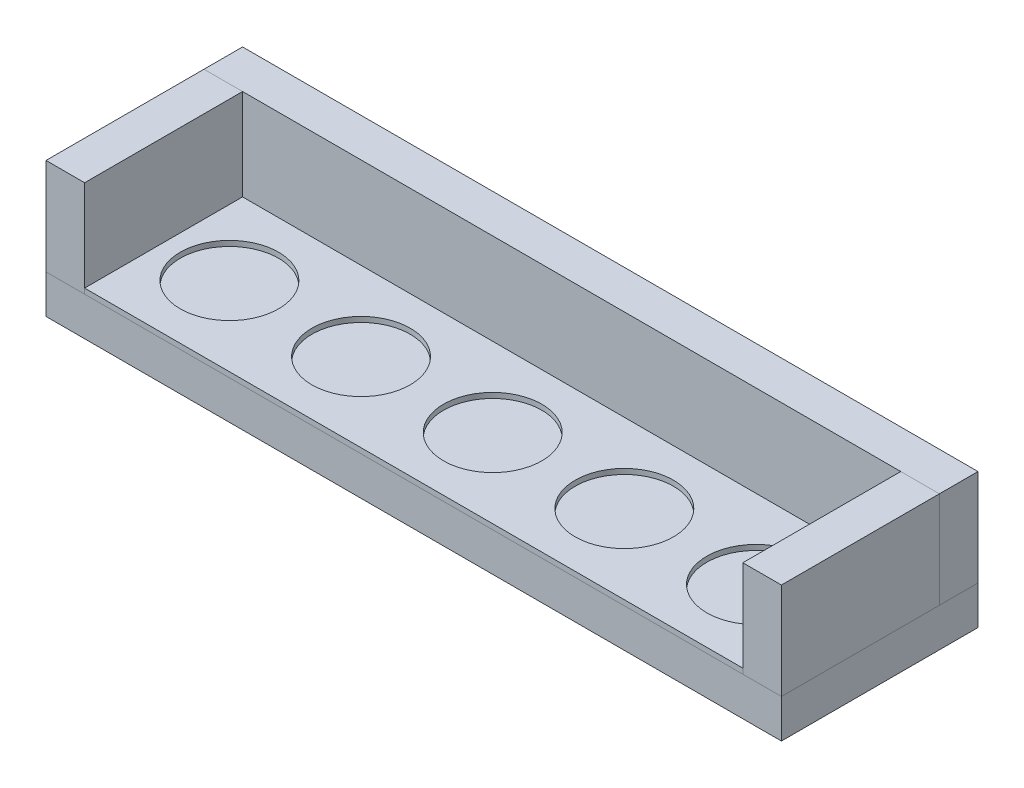
ISO-10303-21;
HEADER;
FILE_DESCRIPTION(('STEP AP214'),'2;1');
FILE_NAME('part.step','',(''),(''),'','','');
FILE_SCHEMA(('AUTOMOTIVE_DESIGN { 1 0 10303 214 1 1 1 1 }'));
ENDSEC;
DATA;
#1=APPLICATION_CONTEXT('core data for automotive mechanical design processes');
#2=APPLICATION_PROTOCOL_DEFINITION('international standard','automotive_design',2000,#1);
#3=PRODUCT_CONTEXT('',#1,'mechanical');
#4=PRODUCT('Part','Part','',(#3));
#5=PRODUCT_RELATED_PRODUCT_CATEGORY('part','',(#4));
#6=PRODUCT_DEFINITION_FORMATION('','',#4);
#7=PRODUCT_DEFINITION_CONTEXT('part definition',#1,'design');
#8=PRODUCT_DEFINITION('design','',#6,#7);
#9=PRODUCT_DEFINITION_SHAPE('','',#8);
#10=(LENGTH_UNIT() NAMED_UNIT(*) SI_UNIT(.MILLI.,.METRE.));
#11=(NAMED_UNIT(*) PLANE_ANGLE_UNIT() SI_UNIT($,.RADIAN.));
#12=(NAMED_UNIT(*) SI_UNIT($,.STERADIAN.) SOLID_ANGLE_UNIT());
#13=UNCERTAINTY_MEASURE_WITH_UNIT(LENGTH_MEASURE(1.E-05),#10,'distance_accuracy_value','');
#14=(GEOMETRIC_REPRESENTATION_CONTEXT(3) GLOBAL_UNCERTAINTY_ASSIGNED_CONTEXT((#13)) GLOBAL_UNIT_ASSIGNED_CONTEXT((#10,
#11,#12)) REPRESENTATION_CONTEXT('',''));
#15=CARTESIAN_POINT('',(0.,0.,0.));
#16=DIRECTION('',(0.,0.,1.));
#17=DIRECTION('',(1.,0.,0.));
#18=AXIS2_PLACEMENT_3D('',#15,#16,#17);
#19=CARTESIAN_POINT('',(0.,25.,0.));
#20=DIRECTION('',(0.,-1.,0.));
#21=DIRECTION('',(0.,0.,-1.));
#22=AXIS2_PLACEMENT_3D('',#19,#20,#21);
#23=PLANE('',#22);
#24=DIRECTION('',(0.,0.,1.));
#25=VECTOR('',#24,1.);
#26=CARTESIAN_POINT('',(-187.5,25.,0.));
#27=LINE('',#26,#25);
#28=CARTESIAN_POINT('',(-187.5,25.,-90.));
#29=VERTEX_POINT('',#28);
#30=CARTESIAN_POINT('',(-187.5,25.,0.));
#31=VERTEX_POINT('',#30);
#32=EDGE_CURVE('E102',#29,#31,#27,.T.);
#33=ORIENTED_EDGE('',*,*,#32,.T.);
#34=DIRECTION('',(1.,0.,0.));
#35=VECTOR('',#34,1.);
#36=CARTESIAN_POINT('',(-187.5,25.,0.));
#37=LINE('',#36,#35);
#38=CARTESIAN_POINT('',(187.5,25.,0.));
#39=VERTEX_POINT('',#38);
#40=EDGE_CURVE('E97',#31,#39,#37,.T.);
#41=ORIENTED_EDGE('',*,*,#40,.T.);
#42=DIRECTION('',(0.,0.,-1.));
#43=VECTOR('',#42,1.);
#44=CARTESIAN_POINT('',(187.5,25.,0.));
#45=LINE('',#44,#43);
#46=CARTESIAN_POINT('',(187.5,25.,-90.));
#47=VERTEX_POINT('',#46);
#48=EDGE_CURVE('E100',#39,#47,#45,.T.);
#49=ORIENTED_EDGE('',*,*,#48,.T.);
#50=DIRECTION('',(-1.,0.,0.));
#51=VECTOR('',#50,1.);
#52=CARTESIAN_POINT('',(-187.5,25.,-90.));
#53=LINE('',#52,#51);
#54=EDGE_CURVE('E67',#47,#29,#53,.T.);
#55=ORIENTED_EDGE('',*,*,#54,.T.);
#56=EDGE_LOOP('',(#33,#41,#49,#55));
#57=FACE_BOUND('',#56,.T.);
#58=CARTESIAN_POINT('',(-150.,25.,-45.));
#59=DIRECTION('',(0.,1.,0.));
#60=DIRECTION('',(0.,0.,1.));
#61=AXIS2_PLACEMENT_3D('',#58,#59,#60);
#62=CIRCLE('',#61,28.);
#63=CARTESIAN_POINT('',(-150.,25.,-17.));
#64=VERTEX_POINT('',#63);
#65=EDGE_CURVE('E117',#64,#64,#62,.T.);
#66=ORIENTED_EDGE('',*,*,#65,.F.);
#67=EDGE_LOOP('',(#66));
#68=FACE_BOUND('',#67,.T.);
#69=CARTESIAN_POINT('',(-75.,25.,-45.));
#70=DIRECTION('',(0.,1.,0.));
#71=DIRECTION('',(0.,0.,1.));
#72=AXIS2_PLACEMENT_3D('',#69,#70,#71);
#73=CIRCLE('',#72,28.);
#74=CARTESIAN_POINT('',(-75.,25.,-17.));
#75=VERTEX_POINT('',#74);
#76=EDGE_CURVE('E132',#75,#75,#73,.T.);
#77=ORIENTED_EDGE('',*,*,#76,.F.);
#78=EDGE_LOOP('',(#77));
#79=FACE_BOUND('',#78,.T.);
#80=CARTESIAN_POINT('',(0.,25.,-45.));
#81=DIRECTION('',(0.,1.,0.));
#82=DIRECTION('',(0.,0.,1.));
#83=AXIS2_PLACEMENT_3D('',#80,#81,#82);
#84=CIRCLE('',#83,28.);
#85=CARTESIAN_POINT('',(0.,25.,-17.));
#86=VERTEX_POINT('',#85);
#87=EDGE_CURVE('E138',#86,#86,#84,.T.);
#88=ORIENTED_EDGE('',*,*,#87,.F.);
#89=EDGE_LOOP('',(#88));
#90=FACE_BOUND('',#89,.T.);
#91=CARTESIAN_POINT('',(75.,25.,-45.));
#92=DIRECTION('',(0.,1.,0.));
#93=DIRECTION('',(0.,0.,1.));
#94=AXIS2_PLACEMENT_3D('',#91,#92,#93);
#95=CIRCLE('',#94,28.);
#96=CARTESIAN_POINT('',(75.,25.,-17.));
#97=VERTEX_POINT('',#96);
#98=EDGE_CURVE('E144',#97,#97,#95,.T.);
#99=ORIENTED_EDGE('',*,*,#98,.F.);
#100=EDGE_LOOP('',(#99));
#101=FACE_BOUND('',#100,.T.);
#102=CARTESIAN_POINT('',(150.,25.,-45.));
#103=DIRECTION('',(0.,1.,0.));
#104=DIRECTION('',(0.,0.,1.));
#105=AXIS2_PLACEMENT_3D('',#102,#103,#104);
#106=CIRCLE('',#105,28.);
#107=CARTESIAN_POINT('',(150.,25.,-17.));
#108=VERTEX_POINT('',#107);
#109=EDGE_CURVE('E150',#108,#108,#106,.T.);
#110=ORIENTED_EDGE('',*,*,#109,.F.);
#111=EDGE_LOOP('',(#110));
#112=FACE_BOUND('',#111,.T.);
#113=ADVANCED_FACE('F50',(#57,#68,#79,#90,#101,#112),#23,.F.);
#114=CARTESIAN_POINT('',(0.,22.,0.));
#115=DIRECTION('',(0.,-1.,0.));
#116=DIRECTION('',(0.,0.,-1.));
#117=AXIS2_PLACEMENT_3D('',#114,#115,#116);
#118=PLANE('',#117);
#119=CARTESIAN_POINT('',(75.,22.,-45.));
#120=DIRECTION('',(0.,1.,0.));
#121=DIRECTION('',(0.,0.,1.));
#122=AXIS2_PLACEMENT_3D('',#119,#120,#121);
#123=CIRCLE('',#122,28.);
#124=CARTESIAN_POINT('',(75.,22.,-17.));
#125=VERTEX_POINT('',#124);
#126=EDGE_CURVE('E147',#125,#125,#123,.T.);
#127=ORIENTED_EDGE('',*,*,#126,.T.);
#128=EDGE_LOOP('',(#127));
#129=FACE_BOUND('',#128,.T.);
#130=CARTESIAN_POINT('',(-75.,22.,-45.));
#131=DIRECTION('',(0.,1.,0.));
#132=DIRECTION('',(0.,0.,1.));
#133=AXIS2_PLACEMENT_3D('',#130,#131,#132);
#134=CIRCLE('',#133,28.);
#135=CARTESIAN_POINT('',(-75.,22.,-17.));
#136=VERTEX_POINT('',#135);
#137=EDGE_CURVE('E135',#136,#136,#134,.T.);
#138=ORIENTED_EDGE('',*,*,#137,.T.);
#139=EDGE_LOOP('',(#138));
#140=FACE_BOUND('',#139,.T.);
#141=DIRECTION('',(0.,0.,1.));
#142=VECTOR('',#141,1.);
#143=CARTESIAN_POINT('',(-187.5,22.,0.));
#144=LINE('',#143,#142);
#145=CARTESIAN_POINT('',(-187.5,22.,-90.));
#146=VERTEX_POINT('',#145);
#147=CARTESIAN_POINT('',(-187.5,22.,0.));
#148=VERTEX_POINT('',#147);
#149=EDGE_CURVE('E114',#146,#148,#144,.T.);
#150=ORIENTED_EDGE('',*,*,#149,.F.);
#151=DIRECTION('',(-1.,0.,0.));
#152=VECTOR('',#151,1.);
#153=CARTESIAN_POINT('',(-187.5,22.,-90.));
#154=LINE('',#153,#152);
#155=CARTESIAN_POINT('',(187.5,22.,-90.));
#156=VERTEX_POINT('',#155);
#157=EDGE_CURVE('E90',#156,#146,#154,.T.);
#158=ORIENTED_EDGE('',*,*,#157,.F.);
#159=DIRECTION('',(0.,0.,-1.));
#160=VECTOR('',#159,1.);
#161=CARTESIAN_POINT('',(187.5,22.,0.));
#162=LINE('',#161,#160);
#163=CARTESIAN_POINT('',(187.5,22.,0.));
#164=VERTEX_POINT('',#163);
#165=EDGE_CURVE('E84',#164,#156,#162,.T.);
#166=ORIENTED_EDGE('',*,*,#165,.F.);
#167=DIRECTION('',(1.,0.,0.));
#168=VECTOR('',#167,1.);
#169=CARTESIAN_POINT('',(-187.5,22.,0.));
#170=LINE('',#169,#168);
#171=EDGE_CURVE('E106',#148,#164,#170,.T.);
#172=ORIENTED_EDGE('',*,*,#171,.F.);
#173=EDGE_LOOP('',(#150,#158,#166,#172));
#174=FACE_BOUND('',#173,.T.);
#175=CARTESIAN_POINT('',(-150.,22.,-45.));
#176=DIRECTION('',(0.,1.,0.));
#177=DIRECTION('',(0.,0.,1.));
#178=AXIS2_PLACEMENT_3D('',#175,#176,#177);
#179=CIRCLE('',#178,28.);
#180=CARTESIAN_POINT('',(-150.,22.,-17.));
#181=VERTEX_POINT('',#180);
#182=EDGE_CURVE('E129',#181,#181,#179,.T.);
#183=ORIENTED_EDGE('',*,*,#182,.T.);
#184=EDGE_LOOP('',(#183));
#185=FACE_BOUND('',#184,.T.);
#186=CARTESIAN_POINT('',(0.,22.,-45.));
#187=DIRECTION('',(0.,1.,0.));
#188=DIRECTION('',(0.,0.,1.));
#189=AXIS2_PLACEMENT_3D('',#186,#187,#188);
#190=CIRCLE('',#189,28.);
#191=CARTESIAN_POINT('',(0.,22.,-17.));
#192=VERTEX_POINT('',#191);
#193=EDGE_CURVE('E141',#192,#192,#190,.T.);
#194=ORIENTED_EDGE('',*,*,#193,.T.);
#195=EDGE_LOOP('',(#194));
#196=FACE_BOUND('',#195,.T.);
#197=CARTESIAN_POINT('',(150.,22.,-45.));
#198=DIRECTION('',(0.,1.,0.));
#199=DIRECTION('',(0.,0.,1.));
#200=AXIS2_PLACEMENT_3D('',#197,#198,#199);
#201=CIRCLE('',#200,28.);
#202=CARTESIAN_POINT('',(150.,22.,-17.));
#203=VERTEX_POINT('',#202);
#204=EDGE_CURVE('E153',#203,#203,#201,.T.);
#205=ORIENTED_EDGE('',*,*,#204,.T.);
#206=EDGE_LOOP('',(#205));
#207=FACE_BOUND('',#206,.T.);
#208=ADVANCED_FACE('F125',(#129,#140,#174,#185,#196,#207),#118,.T.);
#209=CARTESIAN_POINT('',(-187.5,25.,0.));
#210=DIRECTION('',(1.,0.,0.));
#211=DIRECTION('',(0.,0.,-1.));
#212=AXIS2_PLACEMENT_3D('',#209,#210,#211);
#213=PLANE('',#212);
#214=ORIENTED_EDGE('',*,*,#149,.T.);
#215=DIRECTION('',(0.,-1.,0.));
#216=VECTOR('',#215,1.);
#217=CARTESIAN_POINT('',(-187.5,25.,0.));
#218=LINE('',#217,#216);
#219=EDGE_CURVE('E12',#31,#148,#218,.T.);
#220=ORIENTED_EDGE('',*,*,#219,.F.);
#221=ORIENTED_EDGE('',*,*,#32,.F.);
#222=DIRECTION('',(0.,-1.,0.));
#223=VECTOR('',#222,1.);
#224=CARTESIAN_POINT('',(-187.5,25.,-90.));
#225=LINE('',#224,#223);
#226=EDGE_CURVE('E110',#29,#146,#225,.T.);
#227=ORIENTED_EDGE('',*,*,#226,.T.);
#228=EDGE_LOOP('',(#214,#220,#221,#227));
#229=FACE_BOUND('',#228,.T.);
#230=ADVANCED_FACE('F52',(#229),#213,.F.);
#231=CARTESIAN_POINT('',(-187.5,25.,0.));
#232=DIRECTION('',(0.,0.,-1.));
#233=DIRECTION('',(-1.,0.,0.));
#234=AXIS2_PLACEMENT_3D('',#231,#232,#233);
#235=PLANE('',#234);
#236=ORIENTED_EDGE('',*,*,#171,.T.);
#237=DIRECTION('',(0.,-1.,0.));
#238=VECTOR('',#237,1.);
#239=CARTESIAN_POINT('',(187.5,25.,0.));
#240=LINE('',#239,#238);
#241=EDGE_CURVE('E59',#39,#164,#240,.T.);
#242=ORIENTED_EDGE('',*,*,#241,.F.);
#243=ORIENTED_EDGE('',*,*,#40,.F.);
#244=ORIENTED_EDGE('',*,*,#219,.T.);
#245=EDGE_LOOP('',(#236,#242,#243,#244));
#246=FACE_BOUND('',#245,.T.);
#247=ADVANCED_FACE('F105',(#246),#235,.F.);
#248=CARTESIAN_POINT('',(187.5,25.,0.));
#249=DIRECTION('',(-1.,0.,0.));
#250=DIRECTION('',(0.,0.,1.));
#251=AXIS2_PLACEMENT_3D('',#248,#249,#250);
#252=PLANE('',#251);
#253=ORIENTED_EDGE('',*,*,#165,.T.);
#254=DIRECTION('',(0.,-1.,0.));
#255=VECTOR('',#254,1.);
#256=CARTESIAN_POINT('',(187.5,25.,-90.));
#257=LINE('',#256,#255);
#258=EDGE_CURVE('E107',#47,#156,#257,.T.);
#259=ORIENTED_EDGE('',*,*,#258,.F.);
#260=ORIENTED_EDGE('',*,*,#48,.F.);
#261=ORIENTED_EDGE('',*,*,#241,.T.);
#262=EDGE_LOOP('',(#253,#259,#260,#261));
#263=FACE_BOUND('',#262,.T.);
#264=ADVANCED_FACE('F108',(#263),#252,.F.);
#265=CARTESIAN_POINT('',(-187.5,25.,-90.));
#266=DIRECTION('',(0.,0.,1.));
#267=DIRECTION('',(1.,0.,0.));
#268=AXIS2_PLACEMENT_3D('',#265,#266,#267);
#269=PLANE('',#268);
#270=ORIENTED_EDGE('',*,*,#157,.T.);
#271=ORIENTED_EDGE('',*,*,#226,.F.);
#272=ORIENTED_EDGE('',*,*,#54,.F.);
#273=ORIENTED_EDGE('',*,*,#258,.T.);
#274=EDGE_LOOP('',(#270,#271,#272,#273));
#275=FACE_BOUND('',#274,.T.);
#276=ADVANCED_FACE('F122',(#275),#269,.F.);
#277=CARTESIAN_POINT('',(-150.,25.,-45.));
#278=DIRECTION('',(0.,-1.,0.));
#279=DIRECTION('',(0.,0.,-1.));
#280=AXIS2_PLACEMENT_3D('',#277,#278,#279);
#281=CYLINDRICAL_SURFACE('',#280,28.);
#282=ORIENTED_EDGE('',*,*,#65,.T.);
#283=EDGE_LOOP('',(#282));
#284=FACE_BOUND('',#283,.T.);
#285=ORIENTED_EDGE('',*,*,#182,.F.);
#286=EDGE_LOOP('',(#285));
#287=FACE_BOUND('',#286,.T.);
#288=ADVANCED_FACE('F170',(#284,#287),#281,.F.);
#289=CARTESIAN_POINT('',(-75.,25.,-45.));
#290=DIRECTION('',(0.,-1.,0.));
#291=DIRECTION('',(0.,0.,-1.));
#292=AXIS2_PLACEMENT_3D('',#289,#290,#291);
#293=CYLINDRICAL_SURFACE('',#292,28.);
#294=ORIENTED_EDGE('',*,*,#76,.T.);
#295=EDGE_LOOP('',(#294));
#296=FACE_BOUND('',#295,.T.);
#297=ORIENTED_EDGE('',*,*,#137,.F.);
#298=EDGE_LOOP('',(#297));
#299=FACE_BOUND('',#298,.T.);
#300=ADVANCED_FACE('F205',(#296,#299),#293,.F.);
#301=CARTESIAN_POINT('',(0.,25.,-45.));
#302=DIRECTION('',(0.,-1.,0.));
#303=DIRECTION('',(0.,0.,-1.));
#304=AXIS2_PLACEMENT_3D('',#301,#302,#303);
#305=CYLINDRICAL_SURFACE('',#304,28.);
#306=ORIENTED_EDGE('',*,*,#87,.T.);
#307=EDGE_LOOP('',(#306));
#308=FACE_BOUND('',#307,.T.);
#309=ORIENTED_EDGE('',*,*,#193,.F.);
#310=EDGE_LOOP('',(#309));
#311=FACE_BOUND('',#310,.T.);
#312=ADVANCED_FACE('F212',(#308,#311),#305,.F.);
#313=CARTESIAN_POINT('',(75.,25.,-45.));
#314=DIRECTION('',(0.,-1.,0.));
#315=DIRECTION('',(0.,0.,-1.));
#316=AXIS2_PLACEMENT_3D('',#313,#314,#315);
#317=CYLINDRICAL_SURFACE('',#316,28.);
#318=ORIENTED_EDGE('',*,*,#98,.T.);
#319=EDGE_LOOP('',(#318));
#320=FACE_BOUND('',#319,.T.);
#321=ORIENTED_EDGE('',*,*,#126,.F.);
#322=EDGE_LOOP('',(#321));
#323=FACE_BOUND('',#322,.T.);
#324=ADVANCED_FACE('F219',(#320,#323),#317,.F.);
#325=CARTESIAN_POINT('',(150.,25.,-45.));
#326=DIRECTION('',(0.,-1.,0.));
#327=DIRECTION('',(0.,0.,-1.));
#328=AXIS2_PLACEMENT_3D('',#325,#326,#327);
#329=CYLINDRICAL_SURFACE('',#328,28.);
#330=ORIENTED_EDGE('',*,*,#109,.T.);
#331=EDGE_LOOP('',(#330));
#332=FACE_BOUND('',#331,.T.);
#333=ORIENTED_EDGE('',*,*,#204,.F.);
#334=EDGE_LOOP('',(#333));
#335=FACE_BOUND('',#334,.T.);
#336=ADVANCED_FACE('F159',(#332,#335),#329,.F.);
#337=CLOSED_SHELL('',(#113,#208,#230,#247,#264,#276,#288,#300,#312,#324,#336));
#338=MANIFOLD_SOLID_BREP('B2',#337);
#339=CARTESIAN_POINT('',(209.5,169.649878575204,0.));
#340=DIRECTION('',(-1.,0.,0.));
#341=DIRECTION('',(0.,0.,1.));
#342=AXIS2_PLACEMENT_3D('',#339,#340,#341);
#343=PLANE('',#342);
#344=DIRECTION('',(0.,0.,-1.));
#345=VECTOR('',#344,1.);
#346=CARTESIAN_POINT('',(209.5,77.,0.));
#347=LINE('',#346,#345);
#348=CARTESIAN_POINT('',(209.5,77.,0.));
#349=VERTEX_POINT('',#348);
#350=CARTESIAN_POINT('',(209.5,77.,-90.));
#351=VERTEX_POINT('',#350);
#352=EDGE_CURVE('E317',#349,#351,#347,.T.);
#353=ORIENTED_EDGE('',*,*,#352,.F.);
#354=DIRECTION('',(0.,-1.,0.));
#355=VECTOR('',#354,1.);
#356=CARTESIAN_POINT('',(209.5,169.649878575204,0.));
#357=LINE('',#356,#355);
#358=CARTESIAN_POINT('',(209.5,22.,0.));
#359=VERTEX_POINT('',#358);
#360=EDGE_CURVE('E271',#349,#359,#357,.T.);
#361=ORIENTED_EDGE('',*,*,#360,.T.);
#362=DIRECTION('',(0.,0.,-1.));
#363=VECTOR('',#362,1.);
#364=CARTESIAN_POINT('',(209.5,22.,0.));
#365=LINE('',#364,#363);
#366=CARTESIAN_POINT('',(209.5,22.,-90.));
#367=VERTEX_POINT('',#366);
#368=EDGE_CURVE('E315',#359,#367,#365,.T.);
#369=ORIENTED_EDGE('',*,*,#368,.T.);
#370=DIRECTION('',(0.,-1.,0.));
#371=VECTOR('',#370,1.);
#372=CARTESIAN_POINT('',(209.5,169.649878575204,-90.));
#373=LINE('',#372,#371);
#374=EDGE_CURVE('E306',#351,#367,#373,.T.);
#375=ORIENTED_EDGE('',*,*,#374,.F.);
#376=EDGE_LOOP('',(#353,#361,#369,#375));
#377=FACE_BOUND('',#376,.T.);
#378=ADVANCED_FACE('F267',(#377),#343,.F.);
#379=CARTESIAN_POINT('',(209.5,169.649878575204,-90.));
#380=DIRECTION('',(0.,0.,1.));
#381=DIRECTION('',(1.,0.,0.));
#382=AXIS2_PLACEMENT_3D('',#379,#380,#381);
#383=PLANE('',#382);
#384=DIRECTION('',(-1.,0.,0.));
#385=VECTOR('',#384,1.);
#386=CARTESIAN_POINT('',(209.5,77.,-90.));
#387=LINE('',#386,#385);
#388=CARTESIAN_POINT('',(187.5,77.,-90.));
#389=VERTEX_POINT('',#388);
#390=EDGE_CURVE('E276',#351,#389,#387,.T.);
#391=ORIENTED_EDGE('',*,*,#390,.F.);
#392=ORIENTED_EDGE('',*,*,#374,.T.);
#393=DIRECTION('',(-1.,0.,0.));
#394=VECTOR('',#393,1.);
#395=CARTESIAN_POINT('',(209.5,22.,-90.));
#396=LINE('',#395,#394);
#397=CARTESIAN_POINT('',(187.5,22.,-90.));
#398=VERTEX_POINT('',#397);
#399=EDGE_CURVE('E327',#367,#398,#396,.T.);
#400=ORIENTED_EDGE('',*,*,#399,.T.);
#401=DIRECTION('',(0.,-1.,0.));
#402=VECTOR('',#401,1.);
#403=CARTESIAN_POINT('',(187.5,169.649878575204,-90.));
#404=LINE('',#403,#402);
#405=EDGE_CURVE('E336',#389,#398,#404,.T.);
#406=ORIENTED_EDGE('',*,*,#405,.F.);
#407=EDGE_LOOP('',(#391,#392,#400,#406));
#408=FACE_BOUND('',#407,.T.);
#409=ADVANCED_FACE('F340',(#408),#383,.F.);
#410=CARTESIAN_POINT('',(187.5,169.649878575204,0.));
#411=DIRECTION('',(1.,0.,0.));
#412=DIRECTION('',(0.,0.,-1.));
#413=AXIS2_PLACEMENT_3D('',#410,#411,#412);
#414=PLANE('',#413);
#415=DIRECTION('',(0.,0.,1.));
#416=VECTOR('',#415,1.);
#417=CARTESIAN_POINT('',(187.5,77.,0.));
#418=LINE('',#417,#416);
#419=CARTESIAN_POINT('',(187.5,77.,0.));
#420=VERTEX_POINT('',#419);
#421=EDGE_CURVE('E48',#389,#420,#418,.T.);
#422=ORIENTED_EDGE('',*,*,#421,.F.);
#423=ORIENTED_EDGE('',*,*,#405,.T.);
#424=DIRECTION('',(0.,0.,1.));
#425=VECTOR('',#424,1.);
#426=CARTESIAN_POINT('',(187.5,22.,0.));
#427=LINE('',#426,#425);
#428=CARTESIAN_POINT('',(187.5,22.,0.));
#429=VERTEX_POINT('',#428);
#430=EDGE_CURVE('E337',#398,#429,#427,.T.);
#431=ORIENTED_EDGE('',*,*,#430,.T.);
#432=DIRECTION('',(0.,-1.,0.));
#433=VECTOR('',#432,1.);
#434=CARTESIAN_POINT('',(187.5,169.649878575204,0.));
#435=LINE('',#434,#433);
#436=EDGE_CURVE('E289',#420,#429,#435,.T.);
#437=ORIENTED_EDGE('',*,*,#436,.F.);
#438=EDGE_LOOP('',(#422,#423,#431,#437));
#439=FACE_BOUND('',#438,.T.);
#440=ADVANCED_FACE('F339',(#439),#414,.F.);
#441=CARTESIAN_POINT('',(209.5,169.649878575204,0.));
#442=DIRECTION('',(0.,0.,-1.));
#443=DIRECTION('',(-1.,0.,0.));
#444=AXIS2_PLACEMENT_3D('',#441,#442,#443);
#445=PLANE('',#444);
#446=DIRECTION('',(1.,0.,0.));
#447=VECTOR('',#446,1.);
#448=CARTESIAN_POINT('',(209.5,77.,0.));
#449=LINE('',#448,#447);
#450=EDGE_CURVE('E324',#420,#349,#449,.T.);
#451=ORIENTED_EDGE('',*,*,#450,.F.);
#452=ORIENTED_EDGE('',*,*,#436,.T.);
#453=DIRECTION('',(1.,0.,0.));
#454=VECTOR('',#453,1.);
#455=CARTESIAN_POINT('',(209.5,22.,0.));
#456=LINE('',#455,#454);
#457=EDGE_CURVE('E320',#429,#359,#456,.T.);
#458=ORIENTED_EDGE('',*,*,#457,.T.);
#459=ORIENTED_EDGE('',*,*,#360,.F.);
#460=EDGE_LOOP('',(#451,#452,#458,#459));
#461=FACE_BOUND('',#460,.T.);
#462=ADVANCED_FACE('F321',(#461),#445,.F.);
#463=CARTESIAN_POINT('',(0.,22.,0.));
#464=DIRECTION('',(0.,1.,0.));
#465=DIRECTION('',(0.,0.,1.));
#466=AXIS2_PLACEMENT_3D('',#463,#464,#465);
#467=PLANE('',#466);
#468=ORIENTED_EDGE('',*,*,#368,.F.);
#469=ORIENTED_EDGE('',*,*,#457,.F.);
#470=ORIENTED_EDGE('',*,*,#430,.F.);
#471=ORIENTED_EDGE('',*,*,#399,.F.);
#472=EDGE_LOOP('',(#468,#469,#470,#471));
#473=FACE_BOUND('',#472,.T.);
#474=ADVANCED_FACE('F326',(#473),#467,.F.);
#475=CARTESIAN_POINT('',(0.,77.,0.));
#476=DIRECTION('',(0.,1.,0.));
#477=DIRECTION('',(0.,0.,1.));
#478=AXIS2_PLACEMENT_3D('',#475,#476,#477);
#479=PLANE('',#478);
#480=ORIENTED_EDGE('',*,*,#450,.T.);
#481=ORIENTED_EDGE('',*,*,#352,.T.);
#482=ORIENTED_EDGE('',*,*,#390,.T.);
#483=ORIENTED_EDGE('',*,*,#421,.T.);
#484=EDGE_LOOP('',(#480,#481,#482,#483));
#485=FACE_BOUND('',#484,.T.);
#486=ADVANCED_FACE('F269',(#485),#479,.T.);
#487=CLOSED_SHELL('',(#378,#409,#440,#462,#474,#486));
#488=MANIFOLD_SOLID_BREP('B6',#487);
#489=CARTESIAN_POINT('',(-209.5,169.649878575204,0.));
#490=DIRECTION('',(1.,0.,0.));
#491=DIRECTION('',(0.,0.,-1.));
#492=AXIS2_PLACEMENT_3D('',#489,#490,#491);
#493=PLANE('',#492);
#494=DIRECTION('',(0.,0.,1.));
#495=VECTOR('',#494,1.);
#496=CARTESIAN_POINT('',(-209.5,77.,0.));
#497=LINE('',#496,#495);
#498=CARTESIAN_POINT('',(-209.5,77.,-90.));
#499=VERTEX_POINT('',#498);
#500=CARTESIAN_POINT('',(-209.5,77.,0.));
#501=VERTEX_POINT('',#500);
#502=EDGE_CURVE('E439',#499,#501,#497,.T.);
#503=ORIENTED_EDGE('',*,*,#502,.F.);
#504=DIRECTION('',(0.,-1.,0.));
#505=VECTOR('',#504,1.);
#506=CARTESIAN_POINT('',(-209.5,169.649878575204,-90.));
#507=LINE('',#506,#505);
#508=CARTESIAN_POINT('',(-209.5,22.,-90.));
#509=VERTEX_POINT('',#508);
#510=EDGE_CURVE('E393',#499,#509,#507,.T.);
#511=ORIENTED_EDGE('',*,*,#510,.T.);
#512=DIRECTION('',(0.,0.,1.));
#513=VECTOR('',#512,1.);
#514=CARTESIAN_POINT('',(-209.5,22.,0.));
#515=LINE('',#514,#513);
#516=CARTESIAN_POINT('',(-209.5,22.,0.));
#517=VERTEX_POINT('',#516);
#518=EDGE_CURVE('E437',#509,#517,#515,.T.);
#519=ORIENTED_EDGE('',*,*,#518,.T.);
#520=DIRECTION('',(0.,-1.,0.));
#521=VECTOR('',#520,1.);
#522=CARTESIAN_POINT('',(-209.5,169.649878575204,0.));
#523=LINE('',#522,#521);
#524=EDGE_CURVE('E428',#501,#517,#523,.T.);
#525=ORIENTED_EDGE('',*,*,#524,.F.);
#526=EDGE_LOOP('',(#503,#511,#519,#525));
#527=FACE_BOUND('',#526,.T.);
#528=ADVANCED_FACE('F389',(#527),#493,.F.);
#529=CARTESIAN_POINT('',(-209.5,169.649878575204,0.));
#530=DIRECTION('',(0.,0.,-1.));
#531=DIRECTION('',(-1.,0.,0.));
#532=AXIS2_PLACEMENT_3D('',#529,#530,#531);
#533=PLANE('',#532);
#534=DIRECTION('',(1.,0.,0.));
#535=VECTOR('',#534,1.);
#536=CARTESIAN_POINT('',(-209.5,77.,0.));
#537=LINE('',#536,#535);
#538=CARTESIAN_POINT('',(-187.5,77.,0.));
#539=VERTEX_POINT('',#538);
#540=EDGE_CURVE('E398',#501,#539,#537,.T.);
#541=ORIENTED_EDGE('',*,*,#540,.F.);
#542=ORIENTED_EDGE('',*,*,#524,.T.);
#543=DIRECTION('',(1.,0.,0.));
#544=VECTOR('',#543,1.);
#545=CARTESIAN_POINT('',(-209.5,22.,0.));
#546=LINE('',#545,#544);
#547=CARTESIAN_POINT('',(-187.5,22.,0.));
#548=VERTEX_POINT('',#547);
#549=EDGE_CURVE('E449',#517,#548,#546,.T.);
#550=ORIENTED_EDGE('',*,*,#549,.T.);
#551=DIRECTION('',(0.,-1.,0.));
#552=VECTOR('',#551,1.);
#553=CARTESIAN_POINT('',(-187.5,169.649878575204,0.));
#554=LINE('',#553,#552);
#555=EDGE_CURVE('E458',#539,#548,#554,.T.);
#556=ORIENTED_EDGE('',*,*,#555,.F.);
#557=EDGE_LOOP('',(#541,#542,#550,#556));
#558=FACE_BOUND('',#557,.T.);
#559=ADVANCED_FACE('F462',(#558),#533,.F.);
#560=CARTESIAN_POINT('',(-187.5,169.649878575204,0.));
#561=DIRECTION('',(-1.,0.,0.));
#562=DIRECTION('',(0.,0.,1.));
#563=AXIS2_PLACEMENT_3D('',#560,#561,#562);
#564=PLANE('',#563);
#565=DIRECTION('',(0.,0.,-1.));
#566=VECTOR('',#565,1.);
#567=CARTESIAN_POINT('',(-187.5,77.,0.));
#568=LINE('',#567,#566);
#569=CARTESIAN_POINT('',(-187.5,77.,-90.));
#570=VERTEX_POINT('',#569);
#571=EDGE_CURVE('E265',#539,#570,#568,.T.);
#572=ORIENTED_EDGE('',*,*,#571,.F.);
#573=ORIENTED_EDGE('',*,*,#555,.T.);
#574=DIRECTION('',(0.,0.,-1.));
#575=VECTOR('',#574,1.);
#576=CARTESIAN_POINT('',(-187.5,22.,0.));
#577=LINE('',#576,#575);
#578=CARTESIAN_POINT('',(-187.5,22.,-90.));
#579=VERTEX_POINT('',#578);
#580=EDGE_CURVE('E459',#548,#579,#577,.T.);
#581=ORIENTED_EDGE('',*,*,#580,.T.);
#582=DIRECTION('',(0.,-1.,0.));
#583=VECTOR('',#582,1.);
#584=CARTESIAN_POINT('',(-187.5,169.649878575204,-90.));
#585=LINE('',#584,#583);
#586=EDGE_CURVE('E411',#570,#579,#585,.T.);
#587=ORIENTED_EDGE('',*,*,#586,.F.);
#588=EDGE_LOOP('',(#572,#573,#581,#587));
#589=FACE_BOUND('',#588,.T.);
#590=ADVANCED_FACE('F461',(#589),#564,.F.);
#591=CARTESIAN_POINT('',(-209.5,169.649878575204,-90.));
#592=DIRECTION('',(0.,0.,1.));
#593=DIRECTION('',(1.,0.,0.));
#594=AXIS2_PLACEMENT_3D('',#591,#592,#593);
#595=PLANE('',#594);
#596=DIRECTION('',(-1.,0.,0.));
#597=VECTOR('',#596,1.);
#598=CARTESIAN_POINT('',(-209.5,77.,-90.));
#599=LINE('',#598,#597);
#600=EDGE_CURVE('E446',#570,#499,#599,.T.);
#601=ORIENTED_EDGE('',*,*,#600,.F.);
#602=ORIENTED_EDGE('',*,*,#586,.T.);
#603=DIRECTION('',(-1.,0.,0.));
#604=VECTOR('',#603,1.);
#605=CARTESIAN_POINT('',(-209.5,22.,-90.));
#606=LINE('',#605,#604);
#607=EDGE_CURVE('E442',#579,#509,#606,.T.);
#608=ORIENTED_EDGE('',*,*,#607,.T.);
#609=ORIENTED_EDGE('',*,*,#510,.F.);
#610=EDGE_LOOP('',(#601,#602,#608,#609));
#611=FACE_BOUND('',#610,.T.);
#612=ADVANCED_FACE('F443',(#611),#595,.F.);
#613=CARTESIAN_POINT('',(0.,22.,0.));
#614=DIRECTION('',(0.,-1.,0.));
#615=DIRECTION('',(0.,0.,-1.));
#616=AXIS2_PLACEMENT_3D('',#613,#614,#615);
#617=PLANE('',#616);
#618=ORIENTED_EDGE('',*,*,#518,.F.);
#619=ORIENTED_EDGE('',*,*,#607,.F.);
#620=ORIENTED_EDGE('',*,*,#580,.F.);
#621=ORIENTED_EDGE('',*,*,#549,.F.);
#622=EDGE_LOOP('',(#618,#619,#620,#621));
#623=FACE_BOUND('',#622,.T.);
#624=ADVANCED_FACE('F448',(#623),#617,.T.);
#625=CARTESIAN_POINT('',(0.,77.,0.));
#626=DIRECTION('',(0.,1.,0.));
#627=DIRECTION('',(0.,0.,1.));
#628=AXIS2_PLACEMENT_3D('',#625,#626,#627);
#629=PLANE('',#628);
#630=ORIENTED_EDGE('',*,*,#600,.T.);
#631=ORIENTED_EDGE('',*,*,#502,.T.);
#632=ORIENTED_EDGE('',*,*,#540,.T.);
#633=ORIENTED_EDGE('',*,*,#571,.T.);
#634=EDGE_LOOP('',(#630,#631,#632,#633));
#635=FACE_BOUND('',#634,.T.);
#636=ADVANCED_FACE('F391',(#635),#629,.T.);
#637=CLOSED_SHELL('',(#528,#559,#590,#612,#624,#636));
#638=MANIFOLD_SOLID_BREP('B42',#637);
#639=CARTESIAN_POINT('',(-209.5,77.,-112.));
#640=DIRECTION('',(1.,0.,0.));
#641=DIRECTION('',(0.,0.,-1.));
#642=AXIS2_PLACEMENT_3D('',#639,#640,#641);
#643=PLANE('',#642);
#644=DIRECTION('',(0.,0.,1.));
#645=VECTOR('',#644,1.);
#646=CARTESIAN_POINT('',(-209.5,22.,-112.));
#647=LINE('',#646,#645);
#648=CARTESIAN_POINT('',(-209.5,22.,-112.));
#649=VERTEX_POINT('',#648);
#650=CARTESIAN_POINT('',(-209.5,22.,-90.));
#651=VERTEX_POINT('',#650);
#652=EDGE_CURVE('E573',#649,#651,#647,.T.);
#653=ORIENTED_EDGE('',*,*,#652,.T.);
#654=DIRECTION('',(0.,-1.,0.));
#655=VECTOR('',#654,1.);
#656=CARTESIAN_POINT('',(-209.5,77.,-90.));
#657=LINE('',#656,#655);
#658=CARTESIAN_POINT('',(-209.5,77.,-90.));
#659=VERTEX_POINT('',#658);
#660=EDGE_CURVE('E387',#659,#651,#657,.T.);
#661=ORIENTED_EDGE('',*,*,#660,.F.);
#662=DIRECTION('',(0.,0.,1.));
#663=VECTOR('',#662,1.);
#664=CARTESIAN_POINT('',(-209.5,77.,-112.));
#665=LINE('',#664,#663);
#666=CARTESIAN_POINT('',(-209.5,77.,-112.));
#667=VERTEX_POINT('',#666);
#668=EDGE_CURVE('E561',#667,#659,#665,.T.);
#669=ORIENTED_EDGE('',*,*,#668,.F.);
#670=DIRECTION('',(0.,-1.,0.));
#671=VECTOR('',#670,1.);
#672=CARTESIAN_POINT('',(-209.5,77.,-112.));
#673=LINE('',#672,#671);
#674=EDGE_CURVE('E569',#667,#649,#673,.T.);
#675=ORIENTED_EDGE('',*,*,#674,.T.);
#676=EDGE_LOOP('',(#653,#661,#669,#675));
#677=FACE_BOUND('',#676,.T.);
#678=ADVANCED_FACE('F510',(#677),#643,.F.);
#679=CARTESIAN_POINT('',(-209.5,77.,-90.));
#680=DIRECTION('',(0.,0.,-1.));
#681=DIRECTION('',(-1.,0.,0.));
#682=AXIS2_PLACEMENT_3D('',#679,#680,#681);
#683=PLANE('',#682);
#684=DIRECTION('',(1.,0.,0.));
#685=VECTOR('',#684,1.);
#686=CARTESIAN_POINT('',(-209.5,22.,-90.));
#687=LINE('',#686,#685);
#688=CARTESIAN_POINT('',(209.5,22.,-90.));
#689=VERTEX_POINT('',#688);
#690=EDGE_CURVE('E565',#651,#689,#687,.T.);
#691=ORIENTED_EDGE('',*,*,#690,.T.);
#692=DIRECTION('',(0.,-1.,0.));
#693=VECTOR('',#692,1.);
#694=CARTESIAN_POINT('',(209.5,77.,-90.));
#695=LINE('',#694,#693);
#696=CARTESIAN_POINT('',(209.5,77.,-90.));
#697=VERTEX_POINT('',#696);
#698=EDGE_CURVE('E518',#697,#689,#695,.T.);
#699=ORIENTED_EDGE('',*,*,#698,.F.);
#700=DIRECTION('',(1.,0.,0.));
#701=VECTOR('',#700,1.);
#702=CARTESIAN_POINT('',(-209.5,77.,-90.));
#703=LINE('',#702,#701);
#704=EDGE_CURVE('E556',#659,#697,#703,.T.);
#705=ORIENTED_EDGE('',*,*,#704,.F.);
#706=ORIENTED_EDGE('',*,*,#660,.T.);
#707=EDGE_LOOP('',(#691,#699,#705,#706));
#708=FACE_BOUND('',#707,.T.);
#709=ADVANCED_FACE('F564',(#708),#683,.F.);
#710=CARTESIAN_POINT('',(209.5,77.,-112.));
#711=DIRECTION('',(-1.,0.,0.));
#712=DIRECTION('',(0.,0.,1.));
#713=AXIS2_PLACEMENT_3D('',#710,#711,#712);
#714=PLANE('',#713);
#715=DIRECTION('',(0.,0.,-1.));
#716=VECTOR('',#715,1.);
#717=CARTESIAN_POINT('',(209.5,22.,-112.));
#718=LINE('',#717,#716);
#719=CARTESIAN_POINT('',(209.5,22.,-112.));
#720=VERTEX_POINT('',#719);
#721=EDGE_CURVE('E543',#689,#720,#718,.T.);
#722=ORIENTED_EDGE('',*,*,#721,.T.);
#723=DIRECTION('',(0.,-1.,0.));
#724=VECTOR('',#723,1.);
#725=CARTESIAN_POINT('',(209.5,77.,-112.));
#726=LINE('',#725,#724);
#727=CARTESIAN_POINT('',(209.5,77.,-112.));
#728=VERTEX_POINT('',#727);
#729=EDGE_CURVE('E566',#728,#720,#726,.T.);
#730=ORIENTED_EDGE('',*,*,#729,.F.);
#731=DIRECTION('',(0.,0.,-1.));
#732=VECTOR('',#731,1.);
#733=CARTESIAN_POINT('',(209.5,77.,-112.));
#734=LINE('',#733,#732);
#735=EDGE_CURVE('E559',#697,#728,#734,.T.);
#736=ORIENTED_EDGE('',*,*,#735,.F.);
#737=ORIENTED_EDGE('',*,*,#698,.T.);
#738=EDGE_LOOP('',(#722,#730,#736,#737));
#739=FACE_BOUND('',#738,.T.);
#740=ADVANCED_FACE('F567',(#739),#714,.F.);
#741=CARTESIAN_POINT('',(-209.5,77.,-112.));
#742=DIRECTION('',(0.,0.,1.));
#743=DIRECTION('',(1.,0.,0.));
#744=AXIS2_PLACEMENT_3D('',#741,#742,#743);
#745=PLANE('',#744);
#746=DIRECTION('',(-1.,0.,0.));
#747=VECTOR('',#746,1.);
#748=CARTESIAN_POINT('',(-209.5,22.,-112.));
#749=LINE('',#748,#747);
#750=EDGE_CURVE('E549',#720,#649,#749,.T.);
#751=ORIENTED_EDGE('',*,*,#750,.T.);
#752=ORIENTED_EDGE('',*,*,#674,.F.);
#753=DIRECTION('',(-1.,0.,0.));
#754=VECTOR('',#753,1.);
#755=CARTESIAN_POINT('',(-209.5,77.,-112.));
#756=LINE('',#755,#754);
#757=EDGE_CURVE('E526',#728,#667,#756,.T.);
#758=ORIENTED_EDGE('',*,*,#757,.F.);
#759=ORIENTED_EDGE('',*,*,#729,.T.);
#760=EDGE_LOOP('',(#751,#752,#758,#759));
#761=FACE_BOUND('',#760,.T.);
#762=ADVANCED_FACE('F580',(#761),#745,.F.);
#763=CARTESIAN_POINT('',(0.,77.,0.));
#764=DIRECTION('',(0.,1.,0.));
#765=DIRECTION('',(0.,0.,1.));
#766=AXIS2_PLACEMENT_3D('',#763,#764,#765);
#767=PLANE('',#766);
#768=ORIENTED_EDGE('',*,*,#668,.T.);
#769=ORIENTED_EDGE('',*,*,#704,.T.);
#770=ORIENTED_EDGE('',*,*,#735,.T.);
#771=ORIENTED_EDGE('',*,*,#757,.T.);
#772=EDGE_LOOP('',(#768,#769,#770,#771));
#773=FACE_BOUND('',#772,.T.);
#774=ADVANCED_FACE('F557',(#773),#767,.T.);
#775=CARTESIAN_POINT('',(0.,22.,0.));
#776=DIRECTION('',(0.,1.,0.));
#777=DIRECTION('',(0.,0.,1.));
#778=AXIS2_PLACEMENT_3D('',#775,#776,#777);
#779=PLANE('',#778);
#780=ORIENTED_EDGE('',*,*,#652,.F.);
#781=ORIENTED_EDGE('',*,*,#750,.F.);
#782=ORIENTED_EDGE('',*,*,#721,.F.);
#783=ORIENTED_EDGE('',*,*,#690,.F.);
#784=EDGE_LOOP('',(#780,#781,#782,#783));
#785=FACE_BOUND('',#784,.T.);
#786=ADVANCED_FACE('F583',(#785),#779,.F.);
#787=CLOSED_SHELL('',(#678,#709,#740,#762,#774,#786));
#788=MANIFOLD_SOLID_BREP('B259',#787);
#789=CARTESIAN_POINT('',(-209.5,22.,-112.));
#790=DIRECTION('',(1.,0.,0.));
#791=DIRECTION('',(0.,0.,-1.));
#792=AXIS2_PLACEMENT_3D('',#789,#790,#791);
#793=PLANE('',#792);
#794=DIRECTION('',(0.,0.,1.));
#795=VECTOR('',#794,1.);
#796=CARTESIAN_POINT('',(-209.5,0.,-112.));
#797=LINE('',#796,#795);
#798=CARTESIAN_POINT('',(-209.5,0.,-112.));
#799=VERTEX_POINT('',#798);
#800=CARTESIAN_POINT('',(-209.5,0.,0.));
#801=VERTEX_POINT('',#800);
#802=EDGE_CURVE('E685',#799,#801,#797,.T.);
#803=ORIENTED_EDGE('',*,*,#802,.T.);
#804=DIRECTION('',(0.,-1.,0.));
#805=VECTOR('',#804,1.);
#806=CARTESIAN_POINT('',(-209.5,22.,0.));
#807=LINE('',#806,#805);
#808=CARTESIAN_POINT('',(-209.5,22.,0.));
#809=VERTEX_POINT('',#808);
#810=EDGE_CURVE('E508',#809,#801,#807,.T.);
#811=ORIENTED_EDGE('',*,*,#810,.F.);
#812=DIRECTION('',(0.,0.,1.));
#813=VECTOR('',#812,1.);
#814=CARTESIAN_POINT('',(-209.5,22.,-112.));
#815=LINE('',#814,#813);
#816=CARTESIAN_POINT('',(-209.5,22.,-112.));
#817=VERTEX_POINT('',#816);
#818=EDGE_CURVE('E673',#817,#809,#815,.T.);
#819=ORIENTED_EDGE('',*,*,#818,.F.);
#820=DIRECTION('',(0.,-1.,0.));
#821=VECTOR('',#820,1.);
#822=CARTESIAN_POINT('',(-209.5,22.,-112.));
#823=LINE('',#822,#821);
#824=EDGE_CURVE('E681',#817,#799,#823,.T.);
#825=ORIENTED_EDGE('',*,*,#824,.T.);
#826=EDGE_LOOP('',(#803,#811,#819,#825));
#827=FACE_BOUND('',#826,.T.);
#828=ADVANCED_FACE('F622',(#827),#793,.F.);
#829=CARTESIAN_POINT('',(-209.5,22.,0.));
#830=DIRECTION('',(0.,0.,-1.));
#831=DIRECTION('',(-1.,0.,0.));
#832=AXIS2_PLACEMENT_3D('',#829,#830,#831);
#833=PLANE('',#832);
#834=DIRECTION('',(1.,0.,0.));
#835=VECTOR('',#834,1.);
#836=CARTESIAN_POINT('',(-209.5,0.,0.));
#837=LINE('',#836,#835);
#838=CARTESIAN_POINT('',(209.5,0.,0.));
#839=VERTEX_POINT('',#838);
#840=EDGE_CURVE('E677',#801,#839,#837,.T.);
#841=ORIENTED_EDGE('',*,*,#840,.T.);
#842=DIRECTION('',(0.,-1.,0.));
#843=VECTOR('',#842,1.);
#844=CARTESIAN_POINT('',(209.5,22.,0.));
#845=LINE('',#844,#843);
#846=CARTESIAN_POINT('',(209.5,22.,0.));
#847=VERTEX_POINT('',#846);
#848=EDGE_CURVE('E630',#847,#839,#845,.T.);
#849=ORIENTED_EDGE('',*,*,#848,.F.);
#850=DIRECTION('',(1.,0.,0.));
#851=VECTOR('',#850,1.);
#852=CARTESIAN_POINT('',(-209.5,22.,0.));
#853=LINE('',#852,#851);
#854=EDGE_CURVE('E668',#809,#847,#853,.T.);
#855=ORIENTED_EDGE('',*,*,#854,.F.);
#856=ORIENTED_EDGE('',*,*,#810,.T.);
#857=EDGE_LOOP('',(#841,#849,#855,#856));
#858=FACE_BOUND('',#857,.T.);
#859=ADVANCED_FACE('F676',(#858),#833,.F.);
#860=CARTESIAN_POINT('',(209.5,22.,-112.));
#861=DIRECTION('',(-1.,0.,0.));
#862=DIRECTION('',(0.,0.,1.));
#863=AXIS2_PLACEMENT_3D('',#860,#861,#862);
#864=PLANE('',#863);
#865=DIRECTION('',(0.,0.,-1.));
#866=VECTOR('',#865,1.);
#867=CARTESIAN_POINT('',(209.5,0.,-112.));
#868=LINE('',#867,#866);
#869=CARTESIAN_POINT('',(209.5,0.,-112.));
#870=VERTEX_POINT('',#869);
#871=EDGE_CURVE('E655',#839,#870,#868,.T.);
#872=ORIENTED_EDGE('',*,*,#871,.T.);
#873=DIRECTION('',(0.,-1.,0.));
#874=VECTOR('',#873,1.);
#875=CARTESIAN_POINT('',(209.5,22.,-112.));
#876=LINE('',#875,#874);
#877=CARTESIAN_POINT('',(209.5,22.,-112.));
#878=VERTEX_POINT('',#877);
#879=EDGE_CURVE('E678',#878,#870,#876,.T.);
#880=ORIENTED_EDGE('',*,*,#879,.F.);
#881=DIRECTION('',(0.,0.,-1.));
#882=VECTOR('',#881,1.);
#883=CARTESIAN_POINT('',(209.5,22.,-112.));
#884=LINE('',#883,#882);
#885=EDGE_CURVE('E671',#847,#878,#884,.T.);
#886=ORIENTED_EDGE('',*,*,#885,.F.);
#887=ORIENTED_EDGE('',*,*,#848,.T.);
#888=EDGE_LOOP('',(#872,#880,#886,#887));
#889=FACE_BOUND('',#888,.T.);
#890=ADVANCED_FACE('F679',(#889),#864,.F.);
#891=CARTESIAN_POINT('',(-209.5,22.,-112.));
#892=DIRECTION('',(0.,0.,1.));
#893=DIRECTION('',(1.,0.,0.));
#894=AXIS2_PLACEMENT_3D('',#891,#892,#893);
#895=PLANE('',#894);
#896=DIRECTION('',(-1.,0.,0.));
#897=VECTOR('',#896,1.);
#898=CARTESIAN_POINT('',(-209.5,0.,-112.));
#899=LINE('',#898,#897);
#900=EDGE_CURVE('E661',#870,#799,#899,.T.);
#901=ORIENTED_EDGE('',*,*,#900,.T.);
#902=ORIENTED_EDGE('',*,*,#824,.F.);
#903=DIRECTION('',(-1.,0.,0.));
#904=VECTOR('',#903,1.);
#905=CARTESIAN_POINT('',(-209.5,22.,-112.));
#906=LINE('',#905,#904);
#907=EDGE_CURVE('E638',#878,#817,#906,.T.);
#908=ORIENTED_EDGE('',*,*,#907,.F.);
#909=ORIENTED_EDGE('',*,*,#879,.T.);
#910=EDGE_LOOP('',(#901,#902,#908,#909));
#911=FACE_BOUND('',#910,.T.);
#912=ADVANCED_FACE('F692',(#911),#895,.F.);
#913=CARTESIAN_POINT('',(0.,22.,0.));
#914=DIRECTION('',(0.,1.,0.));
#915=DIRECTION('',(0.,0.,1.));
#916=AXIS2_PLACEMENT_3D('',#913,#914,#915);
#917=PLANE('',#916);
#918=ORIENTED_EDGE('',*,*,#818,.T.);
#919=ORIENTED_EDGE('',*,*,#854,.T.);
#920=ORIENTED_EDGE('',*,*,#885,.T.);
#921=ORIENTED_EDGE('',*,*,#907,.T.);
#922=EDGE_LOOP('',(#918,#919,#920,#921));
#923=FACE_BOUND('',#922,.T.);
#924=ADVANCED_FACE('F669',(#923),#917,.T.);
#925=CARTESIAN_POINT('',(0.,0.,0.));
#926=DIRECTION('',(0.,1.,0.));
#927=DIRECTION('',(0.,0.,1.));
#928=AXIS2_PLACEMENT_3D('',#925,#926,#927);
#929=PLANE('',#928);
#930=ORIENTED_EDGE('',*,*,#802,.F.);
#931=ORIENTED_EDGE('',*,*,#900,.F.);
#932=ORIENTED_EDGE('',*,*,#871,.F.);
#933=ORIENTED_EDGE('',*,*,#840,.F.);
#934=EDGE_LOOP('',(#930,#931,#932,#933));
#935=FACE_BOUND('',#934,.T.);
#936=ADVANCED_FACE('F695',(#935),#929,.F.);
#937=CLOSED_SHELL('',(#828,#859,#890,#912,#924,#936));
#938=MANIFOLD_SOLID_BREP('B381',#937);
#939=ADVANCED_BREP_SHAPE_REPRESENTATION('',(#18,#338,#488,#638,#788,#938),#14);
#940=SHAPE_DEFINITION_REPRESENTATION(#9,#939);
ENDSEC;
END-ISO-10303-21;
